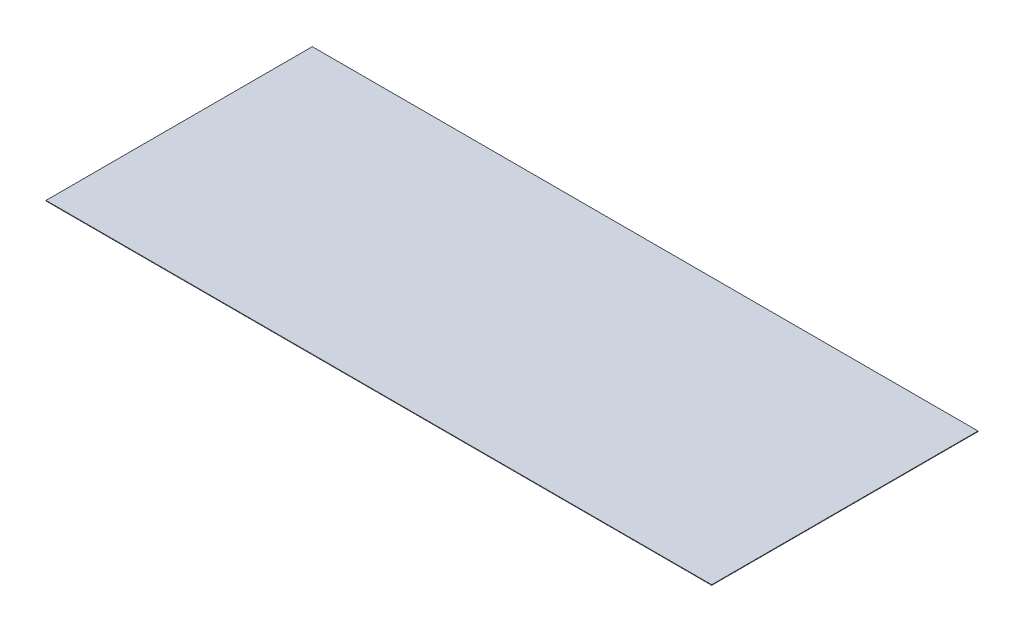
ISO-10303-21;
HEADER;
FILE_DESCRIPTION(('STEP AP214'),'2;1');
FILE_NAME('part.step','',(''),(''),'','','');
FILE_SCHEMA(('AUTOMOTIVE_DESIGN { 1 0 10303 214 1 1 1 1 }'));
ENDSEC;
DATA;
#1=APPLICATION_CONTEXT('core data for automotive mechanical design processes');
#2=APPLICATION_PROTOCOL_DEFINITION('international standard','automotive_design',2000,#1);
#3=PRODUCT_CONTEXT('',#1,'mechanical');
#4=PRODUCT('Part','Part','',(#3));
#5=PRODUCT_RELATED_PRODUCT_CATEGORY('part','',(#4));
#6=PRODUCT_DEFINITION_FORMATION('','',#4);
#7=PRODUCT_DEFINITION_CONTEXT('part definition',#1,'design');
#8=PRODUCT_DEFINITION('design','',#6,#7);
#9=PRODUCT_DEFINITION_SHAPE('','',#8);
#10=(LENGTH_UNIT() NAMED_UNIT(*) SI_UNIT(.MILLI.,.METRE.));
#11=(NAMED_UNIT(*) PLANE_ANGLE_UNIT() SI_UNIT($,.RADIAN.));
#12=(NAMED_UNIT(*) SI_UNIT($,.STERADIAN.) SOLID_ANGLE_UNIT());
#13=UNCERTAINTY_MEASURE_WITH_UNIT(LENGTH_MEASURE(1.E-05),#10,'distance_accuracy_value','');
#14=(GEOMETRIC_REPRESENTATION_CONTEXT(3) GLOBAL_UNCERTAINTY_ASSIGNED_CONTEXT((#13)) GLOBAL_UNIT_ASSIGNED_CONTEXT((#10,
#11,#12)) REPRESENTATION_CONTEXT('',''));
#15=CARTESIAN_POINT('',(0.,0.,0.));
#16=DIRECTION('',(0.,0.,1.));
#17=DIRECTION('',(1.,0.,0.));
#18=AXIS2_PLACEMENT_3D('',#15,#16,#17);
#19=CARTESIAN_POINT('',(125.,0.2,-50.));
#20=DIRECTION('',(-1.,0.,0.));
#21=DIRECTION('',(0.,0.,1.));
#22=AXIS2_PLACEMENT_3D('',#19,#20,#21);
#23=PLANE('',#22);
#24=DIRECTION('',(0.,0.,-1.));
#25=VECTOR('',#24,1.);
#26=CARTESIAN_POINT('',(125.,0.,-50.));
#27=LINE('',#26,#25);
#28=CARTESIAN_POINT('',(125.,0.,50.));
#29=VERTEX_POINT('',#28);
#30=CARTESIAN_POINT('',(125.,0.,-50.));
#31=VERTEX_POINT('',#30);
#32=EDGE_CURVE('E107',#29,#31,#27,.T.);
#33=ORIENTED_EDGE('',*,*,#32,.T.);
#34=DIRECTION('',(0.,-1.,0.));
#35=VECTOR('',#34,1.);
#36=CARTESIAN_POINT('',(125.,0.2,-50.));
#37=LINE('',#36,#35);
#38=CARTESIAN_POINT('',(125.,0.2,-50.));
#39=VERTEX_POINT('',#38);
#40=EDGE_CURVE('E11',#39,#31,#37,.T.);
#41=ORIENTED_EDGE('',*,*,#40,.F.);
#42=DIRECTION('',(0.,0.,-1.));
#43=VECTOR('',#42,1.);
#44=CARTESIAN_POINT('',(125.,0.2,-50.));
#45=LINE('',#44,#43);
#46=CARTESIAN_POINT('',(125.,0.2,50.));
#47=VERTEX_POINT('',#46);
#48=EDGE_CURVE('E91',#47,#39,#45,.T.);
#49=ORIENTED_EDGE('',*,*,#48,.F.);
#50=DIRECTION('',(0.,-1.,0.));
#51=VECTOR('',#50,1.);
#52=CARTESIAN_POINT('',(125.,0.2,50.));
#53=LINE('',#52,#51);
#54=EDGE_CURVE('E103',#47,#29,#53,.T.);
#55=ORIENTED_EDGE('',*,*,#54,.T.);
#56=EDGE_LOOP('',(#33,#41,#49,#55));
#57=FACE_BOUND('',#56,.T.);
#58=ADVANCED_FACE('F39',(#57),#23,.F.);
#59=CARTESIAN_POINT('',(-125.,0.2,-50.));
#60=DIRECTION('',(0.,0.,1.));
#61=DIRECTION('',(1.,0.,0.));
#62=AXIS2_PLACEMENT_3D('',#59,#60,#61);
#63=PLANE('',#62);
#64=DIRECTION('',(-1.,0.,0.));
#65=VECTOR('',#64,1.);
#66=CARTESIAN_POINT('',(-125.,0.,-50.));
#67=LINE('',#66,#65);
#68=CARTESIAN_POINT('',(-125.,0.,-50.));
#69=VERTEX_POINT('',#68);
#70=EDGE_CURVE('E96',#31,#69,#67,.T.);
#71=ORIENTED_EDGE('',*,*,#70,.T.);
#72=DIRECTION('',(0.,-1.,0.));
#73=VECTOR('',#72,1.);
#74=CARTESIAN_POINT('',(-125.,0.2,-50.));
#75=LINE('',#74,#73);
#76=CARTESIAN_POINT('',(-125.,0.2,-50.));
#77=VERTEX_POINT('',#76);
#78=EDGE_CURVE('E48',#77,#69,#75,.T.);
#79=ORIENTED_EDGE('',*,*,#78,.F.);
#80=DIRECTION('',(-1.,0.,0.));
#81=VECTOR('',#80,1.);
#82=CARTESIAN_POINT('',(-125.,0.2,-50.));
#83=LINE('',#82,#81);
#84=EDGE_CURVE('E86',#39,#77,#83,.T.);
#85=ORIENTED_EDGE('',*,*,#84,.F.);
#86=ORIENTED_EDGE('',*,*,#40,.T.);
#87=EDGE_LOOP('',(#71,#79,#85,#86));
#88=FACE_BOUND('',#87,.T.);
#89=ADVANCED_FACE('F95',(#88),#63,.F.);
#90=CARTESIAN_POINT('',(-125.,0.2,-50.));
#91=DIRECTION('',(1.,0.,0.));
#92=DIRECTION('',(0.,0.,-1.));
#93=AXIS2_PLACEMENT_3D('',#90,#91,#92);
#94=PLANE('',#93);
#95=DIRECTION('',(0.,0.,1.));
#96=VECTOR('',#95,1.);
#97=CARTESIAN_POINT('',(-125.,0.,-50.));
#98=LINE('',#97,#96);
#99=CARTESIAN_POINT('',(-125.,0.,50.));
#100=VERTEX_POINT('',#99);
#101=EDGE_CURVE('E73',#69,#100,#98,.T.);
#102=ORIENTED_EDGE('',*,*,#101,.T.);
#103=DIRECTION('',(0.,-1.,0.));
#104=VECTOR('',#103,1.);
#105=CARTESIAN_POINT('',(-125.,0.2,50.));
#106=LINE('',#105,#104);
#107=CARTESIAN_POINT('',(-125.,0.2,50.));
#108=VERTEX_POINT('',#107);
#109=EDGE_CURVE('E98',#108,#100,#106,.T.);
#110=ORIENTED_EDGE('',*,*,#109,.F.);
#111=DIRECTION('',(0.,0.,1.));
#112=VECTOR('',#111,1.);
#113=CARTESIAN_POINT('',(-125.,0.2,-50.));
#114=LINE('',#113,#112);
#115=EDGE_CURVE('E89',#77,#108,#114,.T.);
#116=ORIENTED_EDGE('',*,*,#115,.F.);
#117=ORIENTED_EDGE('',*,*,#78,.T.);
#118=EDGE_LOOP('',(#102,#110,#116,#117));
#119=FACE_BOUND('',#118,.T.);
#120=ADVANCED_FACE('F99',(#119),#94,.F.);
#121=CARTESIAN_POINT('',(-125.,0.2,50.));
#122=DIRECTION('',(0.,0.,-1.));
#123=DIRECTION('',(-1.,0.,0.));
#124=AXIS2_PLACEMENT_3D('',#121,#122,#123);
#125=PLANE('',#124);
#126=DIRECTION('',(1.,0.,0.));
#127=VECTOR('',#126,1.);
#128=CARTESIAN_POINT('',(-125.,0.,50.));
#129=LINE('',#128,#127);
#130=EDGE_CURVE('E79',#100,#29,#129,.T.);
#131=ORIENTED_EDGE('',*,*,#130,.T.);
#132=ORIENTED_EDGE('',*,*,#54,.F.);
#133=DIRECTION('',(1.,0.,0.));
#134=VECTOR('',#133,1.);
#135=CARTESIAN_POINT('',(-125.,0.2,50.));
#136=LINE('',#135,#134);
#137=EDGE_CURVE('E56',#108,#47,#136,.T.);
#138=ORIENTED_EDGE('',*,*,#137,.F.);
#139=ORIENTED_EDGE('',*,*,#109,.T.);
#140=EDGE_LOOP('',(#131,#132,#138,#139));
#141=FACE_BOUND('',#140,.T.);
#142=ADVANCED_FACE('F120',(#141),#125,.F.);
#143=CARTESIAN_POINT('',(0.,0.2,0.));
#144=DIRECTION('',(0.,1.,0.));
#145=DIRECTION('',(0.,0.,1.));
#146=AXIS2_PLACEMENT_3D('',#143,#144,#145);
#147=PLANE('',#146);
#148=ORIENTED_EDGE('',*,*,#48,.T.);
#149=ORIENTED_EDGE('',*,*,#84,.T.);
#150=ORIENTED_EDGE('',*,*,#115,.T.);
#151=ORIENTED_EDGE('',*,*,#137,.T.);
#152=EDGE_LOOP('',(#148,#149,#150,#151));
#153=FACE_BOUND('',#152,.T.);
#154=ADVANCED_FACE('F87',(#153),#147,.T.);
#155=CARTESIAN_POINT('',(0.,0.,0.));
#156=DIRECTION('',(0.,1.,0.));
#157=DIRECTION('',(0.,0.,1.));
#158=AXIS2_PLACEMENT_3D('',#155,#156,#157);
#159=PLANE('',#158);
#160=ORIENTED_EDGE('',*,*,#32,.F.);
#161=ORIENTED_EDGE('',*,*,#130,.F.);
#162=ORIENTED_EDGE('',*,*,#101,.F.);
#163=ORIENTED_EDGE('',*,*,#70,.F.);
#164=EDGE_LOOP('',(#160,#161,#162,#163));
#165=FACE_BOUND('',#164,.T.);
#166=ADVANCED_FACE('F123',(#165),#159,.F.);
#167=CLOSED_SHELL('',(#58,#89,#120,#142,#154,#166));
#168=MANIFOLD_SOLID_BREP('B2',#167);
#169=ADVANCED_BREP_SHAPE_REPRESENTATION('',(#18,#168),#14);
#170=SHAPE_DEFINITION_REPRESENTATION(#9,#169);
ENDSEC;
END-ISO-10303-21;
